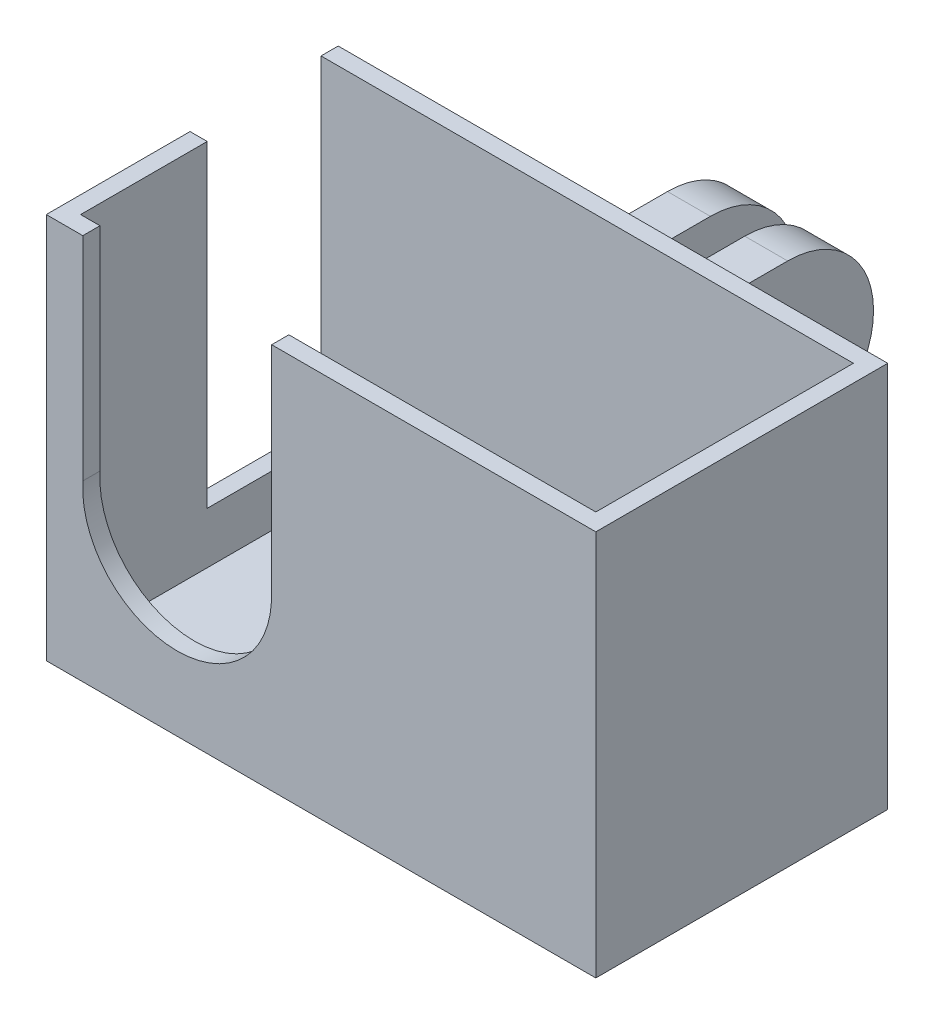
ISO-10303-21;
HEADER;
FILE_DESCRIPTION(('STEP AP214'),'2;1');
FILE_NAME('part.step','',(''),(''),'','','');
FILE_SCHEMA(('AUTOMOTIVE_DESIGN { 1 0 10303 214 1 1 1 1 }'));
ENDSEC;
DATA;
#1=APPLICATION_CONTEXT('core data for automotive mechanical design processes');
#2=APPLICATION_PROTOCOL_DEFINITION('international standard','automotive_design',2000,#1);
#3=PRODUCT_CONTEXT('',#1,'mechanical');
#4=PRODUCT('Part','Part','',(#3));
#5=PRODUCT_RELATED_PRODUCT_CATEGORY('part','',(#4));
#6=PRODUCT_DEFINITION_FORMATION('','',#4);
#7=PRODUCT_DEFINITION_CONTEXT('part definition',#1,'design');
#8=PRODUCT_DEFINITION('design','',#6,#7);
#9=PRODUCT_DEFINITION_SHAPE('','',#8);
#10=(LENGTH_UNIT() NAMED_UNIT(*) SI_UNIT(.MILLI.,.METRE.));
#11=(NAMED_UNIT(*) PLANE_ANGLE_UNIT() SI_UNIT($,.RADIAN.));
#12=(NAMED_UNIT(*) SI_UNIT($,.STERADIAN.) SOLID_ANGLE_UNIT());
#13=UNCERTAINTY_MEASURE_WITH_UNIT(LENGTH_MEASURE(1.E-05),#10,'distance_accuracy_value','');
#14=(GEOMETRIC_REPRESENTATION_CONTEXT(3) GLOBAL_UNCERTAINTY_ASSIGNED_CONTEXT((#13)) GLOBAL_UNIT_ASSIGNED_CONTEXT((#10,
#11,#12)) REPRESENTATION_CONTEXT('',''));
#15=CARTESIAN_POINT('',(0.,0.,0.));
#16=DIRECTION('',(0.,0.,1.));
#17=DIRECTION('',(1.,0.,0.));
#18=AXIS2_PLACEMENT_3D('',#15,#16,#17);
#19=CARTESIAN_POINT('',(-30.346218487395,18.5050420168067,34.));
#20=DIRECTION('',(0.,-1.,0.));
#21=DIRECTION('',(0.,0.,-1.));
#22=AXIS2_PLACEMENT_3D('',#19,#20,#21);
#23=PLANE('',#22);
#24=DIRECTION('',(-1.,0.,0.));
#25=VECTOR('',#24,1.);
#26=CARTESIAN_POINT('',(-30.346218487395,18.5050420168067,34.));
#27=LINE('',#26,#25);
#28=CARTESIAN_POINT('',(-26.0927681715252,18.5050420168067,34.));
#29=VERTEX_POINT('',#28);
#30=CARTESIAN_POINT('',(-30.346218487395,18.5050420168067,34.));
#31=VERTEX_POINT('',#30);
#32=EDGE_CURVE('E412',#29,#31,#27,.T.);
#33=ORIENTED_EDGE('',*,*,#32,.F.);
#34=DIRECTION('',(0.,0.,1.));
#35=VECTOR('',#34,1.);
#36=CARTESIAN_POINT('',(-26.0927681715252,18.5050420168067,-20.0587727318528));
#37=LINE('',#36,#35);
#38=CARTESIAN_POINT('',(-26.0927681715252,18.5050420168067,32.));
#39=VERTEX_POINT('',#38);
#40=EDGE_CURVE('E222',#39,#29,#37,.T.);
#41=ORIENTED_EDGE('',*,*,#40,.F.);
#42=DIRECTION('',(1.,0.,0.));
#43=VECTOR('',#42,1.);
#44=CARTESIAN_POINT('',(-28.346218487395,18.5050420168067,32.));
#45=LINE('',#44,#43);
#46=CARTESIAN_POINT('',(-28.346218487395,18.5050420168067,32.));
#47=VERTEX_POINT('',#46);
#48=EDGE_CURVE('E365',#47,#39,#45,.T.);
#49=ORIENTED_EDGE('',*,*,#48,.F.);
#50=DIRECTION('',(0.,0.,1.));
#51=VECTOR('',#50,1.);
#52=CARTESIAN_POINT('',(-28.346218487395,18.5050420168067,2.));
#53=LINE('',#52,#51);
#54=CARTESIAN_POINT('',(-28.346218487395,18.5050420168067,17.2555006177255));
#55=VERTEX_POINT('',#54);
#56=EDGE_CURVE('E356',#55,#47,#53,.T.);
#57=ORIENTED_EDGE('',*,*,#56,.F.);
#58=DIRECTION('',(-1.,0.,0.));
#59=VECTOR('',#58,1.);
#60=CARTESIAN_POINT('',(11.6754044069533,18.5050420168067,17.2555006177255));
#61=LINE('',#60,#59);
#62=CARTESIAN_POINT('',(-30.346218487395,18.5050420168067,17.2555006177255));
#63=VERTEX_POINT('',#62);
#64=EDGE_CURVE('E261',#55,#63,#61,.T.);
#65=ORIENTED_EDGE('',*,*,#64,.T.);
#66=DIRECTION('',(0.,0.,-1.));
#67=VECTOR('',#66,1.);
#68=CARTESIAN_POINT('',(-30.346218487395,18.5050420168067,34.));
#69=LINE('',#68,#67);
#70=EDGE_CURVE('E430',#31,#63,#69,.T.);
#71=ORIENTED_EDGE('',*,*,#70,.F.);
#72=EDGE_LOOP('',(#33,#41,#49,#57,#65,#71));
#73=FACE_BOUND('',#72,.T.);
#74=ADVANCED_FACE('F41',(#73),#23,.F.);
#75=CARTESIAN_POINT('',(0.,0.,0.));
#76=DIRECTION('',(0.,0.,1.));
#77=DIRECTION('',(1.,0.,0.));
#78=AXIS2_PLACEMENT_3D('',#75,#76,#77);
#79=PLANE('',#78);
#80=DIRECTION('',(0.,-1.,0.));
#81=VECTOR('',#80,1.);
#82=CARTESIAN_POINT('',(-30.346218487395,18.5050420168067,0.));
#83=LINE('',#82,#81);
#84=CARTESIAN_POINT('',(-30.346218487395,18.5050420168067,0.));
#85=VERTEX_POINT('',#84);
#86=CARTESIAN_POINT('',(-30.346218487395,-26.4949579831933,0.));
#87=VERTEX_POINT('',#86);
#88=EDGE_CURVE('E398',#85,#87,#83,.T.);
#89=ORIENTED_EDGE('',*,*,#88,.F.);
#90=DIRECTION('',(-1.,0.,0.));
#91=VECTOR('',#90,1.);
#92=CARTESIAN_POINT('',(-30.346218487395,18.5050420168067,0.));
#93=LINE('',#92,#91);
#94=CARTESIAN_POINT('',(33.653781512605,18.5050420168067,0.));
#95=VERTEX_POINT('',#94);
#96=EDGE_CURVE('E406',#95,#85,#93,.T.);
#97=ORIENTED_EDGE('',*,*,#96,.F.);
#98=DIRECTION('',(0.,1.,0.));
#99=VECTOR('',#98,1.);
#100=CARTESIAN_POINT('',(33.653781512605,18.5050420168067,0.));
#101=LINE('',#100,#99);
#102=CARTESIAN_POINT('',(33.653781512605,-26.4949579831933,0.));
#103=VERTEX_POINT('',#102);
#104=EDGE_CURVE('E424',#103,#95,#101,.T.);
#105=ORIENTED_EDGE('',*,*,#104,.F.);
#106=DIRECTION('',(1.,0.,0.));
#107=VECTOR('',#106,1.);
#108=CARTESIAN_POINT('',(-30.346218487395,-26.4949579831933,0.));
#109=LINE('',#108,#107);
#110=EDGE_CURVE('E421',#87,#103,#109,.T.);
#111=ORIENTED_EDGE('',*,*,#110,.F.);
#112=EDGE_LOOP('',(#89,#97,#105,#111));
#113=FACE_BOUND('',#112,.T.);
#114=DIRECTION('',(-1.,0.,0.));
#115=VECTOR('',#114,1.);
#116=CARTESIAN_POINT('',(7.,7.99964293282017,0.));
#117=LINE('',#116,#115);
#118=CARTESIAN_POINT('',(7.,7.99964293282017,0.));
#119=VERTEX_POINT('',#118);
#120=CARTESIAN_POINT('',(2.,7.99964293282017,0.));
#121=VERTEX_POINT('',#120);
#122=EDGE_CURVE('E328',#119,#121,#117,.T.);
#123=ORIENTED_EDGE('',*,*,#122,.T.);
#124=DIRECTION('',(0.,-1.,0.));
#125=VECTOR('',#124,1.);
#126=CARTESIAN_POINT('',(2.,7.99964293282017,0.));
#127=LINE('',#126,#125);
#128=CARTESIAN_POINT('',(2.,-12.0003570671798,0.));
#129=VERTEX_POINT('',#128);
#130=EDGE_CURVE('E304',#121,#129,#127,.T.);
#131=ORIENTED_EDGE('',*,*,#130,.T.);
#132=DIRECTION('',(-1.,0.,0.));
#133=VECTOR('',#132,1.);
#134=CARTESIAN_POINT('',(7.,-12.0003570671798,0.));
#135=LINE('',#134,#133);
#136=CARTESIAN_POINT('',(7.,-12.0003570671798,0.));
#137=VERTEX_POINT('',#136);
#138=EDGE_CURVE('E352',#137,#129,#135,.T.);
#139=ORIENTED_EDGE('',*,*,#138,.F.);
#140=DIRECTION('',(0.,-1.,0.));
#141=VECTOR('',#140,1.);
#142=CARTESIAN_POINT('',(7.,7.99964293282017,0.));
#143=LINE('',#142,#141);
#144=EDGE_CURVE('E314',#119,#137,#143,.T.);
#145=ORIENTED_EDGE('',*,*,#144,.F.);
#146=EDGE_LOOP('',(#123,#131,#139,#145));
#147=FACE_BOUND('',#146,.T.);
#148=DIRECTION('',(0.,-1.,0.));
#149=VECTOR('',#148,1.);
#150=CARTESIAN_POINT('',(-7.,-12.0003570671798,0.));
#151=LINE('',#150,#149);
#152=CARTESIAN_POINT('',(-7.,7.99964293282017,0.));
#153=VERTEX_POINT('',#152);
#154=CARTESIAN_POINT('',(-7.,-12.0003570671798,0.));
#155=VERTEX_POINT('',#154);
#156=EDGE_CURVE('E282',#153,#155,#151,.T.);
#157=ORIENTED_EDGE('',*,*,#156,.T.);
#158=DIRECTION('',(1.,0.,0.));
#159=VECTOR('',#158,1.);
#160=CARTESIAN_POINT('',(-7.,-12.0003570671798,0.));
#161=LINE('',#160,#159);
#162=CARTESIAN_POINT('',(-2.,-12.0003570671798,0.));
#163=VERTEX_POINT('',#162);
#164=EDGE_CURVE('E300',#155,#163,#161,.T.);
#165=ORIENTED_EDGE('',*,*,#164,.T.);
#166=DIRECTION('',(0.,-1.,0.));
#167=VECTOR('',#166,1.);
#168=CARTESIAN_POINT('',(-2.,-12.0003570671798,0.));
#169=LINE('',#168,#167);
#170=CARTESIAN_POINT('',(-2.,7.99964293282017,0.));
#171=VERTEX_POINT('',#170);
#172=EDGE_CURVE('E275',#171,#163,#169,.T.);
#173=ORIENTED_EDGE('',*,*,#172,.F.);
#174=DIRECTION('',(1.,0.,0.));
#175=VECTOR('',#174,1.);
#176=CARTESIAN_POINT('',(-7.,7.99964293282017,0.));
#177=LINE('',#176,#175);
#178=EDGE_CURVE('E305',#153,#171,#177,.T.);
#179=ORIENTED_EDGE('',*,*,#178,.F.);
#180=EDGE_LOOP('',(#157,#165,#173,#179));
#181=FACE_BOUND('',#180,.T.);
#182=ADVANCED_FACE('F502',(#113,#147,#181),#79,.F.);
#183=CARTESIAN_POINT('',(-30.346218487395,18.5050420168067,34.));
#184=DIRECTION('',(1.,0.,0.));
#185=DIRECTION('',(0.,1.,0.));
#186=AXIS2_PLACEMENT_3D('',#183,#184,#185);
#187=PLANE('',#186);
#188=DIRECTION('',(0.,0.,1.));
#189=VECTOR('',#188,1.);
#190=CARTESIAN_POINT('',(-30.346218487395,-18.4949579831933,2.));
#191=LINE('',#190,#189);
#192=CARTESIAN_POINT('',(-30.346218487395,-18.4949579831933,2.));
#193=VERTEX_POINT('',#192);
#194=CARTESIAN_POINT('',(-30.346218487395,-18.4949579831933,17.2555006177255));
#195=VERTEX_POINT('',#194);
#196=EDGE_CURVE('E235',#193,#195,#191,.T.);
#197=ORIENTED_EDGE('',*,*,#196,.F.);
#198=DIRECTION('',(0.,-1.,0.));
#199=VECTOR('',#198,1.);
#200=CARTESIAN_POINT('',(-30.346218487395,-18.4949579831933,2.));
#201=LINE('',#200,#199);
#202=CARTESIAN_POINT('',(-30.346218487395,18.5050420168067,2.));
#203=VERTEX_POINT('',#202);
#204=EDGE_CURVE('E254',#203,#193,#201,.T.);
#205=ORIENTED_EDGE('',*,*,#204,.F.);
#206=EDGE_CURVE('E417',#203,#85,#69,.T.);
#207=ORIENTED_EDGE('',*,*,#206,.T.);
#208=ORIENTED_EDGE('',*,*,#88,.T.);
#209=DIRECTION('',(0.,0.,-1.));
#210=VECTOR('',#209,1.);
#211=CARTESIAN_POINT('',(-30.346218487395,-26.4949579831933,34.));
#212=LINE('',#211,#210);
#213=CARTESIAN_POINT('',(-30.346218487395,-26.4949579831933,34.));
#214=VERTEX_POINT('',#213);
#215=EDGE_CURVE('E442',#214,#87,#212,.T.);
#216=ORIENTED_EDGE('',*,*,#215,.F.);
#217=DIRECTION('',(0.,-1.,0.));
#218=VECTOR('',#217,1.);
#219=CARTESIAN_POINT('',(-30.346218487395,18.5050420168067,34.));
#220=LINE('',#219,#218);
#221=EDGE_CURVE('E401',#31,#214,#220,.T.);
#222=ORIENTED_EDGE('',*,*,#221,.F.);
#223=ORIENTED_EDGE('',*,*,#70,.T.);
#224=DIRECTION('',(0.,1.,0.));
#225=VECTOR('',#224,1.);
#226=CARTESIAN_POINT('',(-30.346218487395,-18.4949579831933,17.2555006177255));
#227=LINE('',#226,#225);
#228=EDGE_CURVE('E251',#195,#63,#227,.T.);
#229=ORIENTED_EDGE('',*,*,#228,.F.);
#230=EDGE_LOOP('',(#197,#205,#207,#208,#216,#222,#223,#229));
#231=FACE_BOUND('',#230,.T.);
#232=ADVANCED_FACE('F43',(#231),#187,.F.);
#233=CARTESIAN_POINT('',(-30.346218487395,-26.4949579831933,34.));
#234=DIRECTION('',(0.,1.,0.));
#235=DIRECTION('',(0.,0.,1.));
#236=AXIS2_PLACEMENT_3D('',#233,#234,#235);
#237=PLANE('',#236);
#238=ORIENTED_EDGE('',*,*,#110,.T.);
#239=DIRECTION('',(0.,0.,-1.));
#240=VECTOR('',#239,1.);
#241=CARTESIAN_POINT('',(33.653781512605,-26.4949579831933,34.));
#242=LINE('',#241,#240);
#243=CARTESIAN_POINT('',(33.653781512605,-26.4949579831933,34.));
#244=VERTEX_POINT('',#243);
#245=EDGE_CURVE('E438',#244,#103,#242,.T.);
#246=ORIENTED_EDGE('',*,*,#245,.F.);
#247=DIRECTION('',(1.,0.,0.));
#248=VECTOR('',#247,1.);
#249=CARTESIAN_POINT('',(-30.346218487395,-26.4949579831933,34.));
#250=LINE('',#249,#248);
#251=EDGE_CURVE('E405',#214,#244,#250,.T.);
#252=ORIENTED_EDGE('',*,*,#251,.F.);
#253=ORIENTED_EDGE('',*,*,#215,.T.);
#254=EDGE_LOOP('',(#238,#246,#252,#253));
#255=FACE_BOUND('',#254,.T.);
#256=ADVANCED_FACE('F517',(#255),#237,.F.);
#257=CARTESIAN_POINT('',(33.653781512605,18.5050420168067,34.));
#258=DIRECTION('',(-1.,0.,0.));
#259=DIRECTION('',(0.,0.,1.));
#260=AXIS2_PLACEMENT_3D('',#257,#258,#259);
#261=PLANE('',#260);
#262=ORIENTED_EDGE('',*,*,#104,.T.);
#263=DIRECTION('',(0.,0.,-1.));
#264=VECTOR('',#263,1.);
#265=CARTESIAN_POINT('',(33.653781512605,18.5050420168067,34.));
#266=LINE('',#265,#264);
#267=CARTESIAN_POINT('',(33.653781512605,18.5050420168067,34.));
#268=VERTEX_POINT('',#267);
#269=EDGE_CURVE('E434',#268,#95,#266,.T.);
#270=ORIENTED_EDGE('',*,*,#269,.F.);
#271=DIRECTION('',(0.,1.,0.));
#272=VECTOR('',#271,1.);
#273=CARTESIAN_POINT('',(33.653781512605,18.5050420168067,34.));
#274=LINE('',#273,#272);
#275=EDGE_CURVE('E409',#244,#268,#274,.T.);
#276=ORIENTED_EDGE('',*,*,#275,.F.);
#277=ORIENTED_EDGE('',*,*,#245,.T.);
#278=EDGE_LOOP('',(#262,#270,#276,#277));
#279=FACE_BOUND('',#278,.T.);
#280=ADVANCED_FACE('F511',(#279),#261,.F.);
#281=CARTESIAN_POINT('',(-4.09276817152525,18.5050420168067,32.));
#282=VERTEX_POINT('',#281);
#283=CARTESIAN_POINT('',(31.653781512605,18.5050420168067,32.));
#284=VERTEX_POINT('',#283);
#285=EDGE_CURVE('E369',#282,#284,#45,.T.);
#286=ORIENTED_EDGE('',*,*,#285,.F.);
#287=DIRECTION('',(0.,0.,1.));
#288=VECTOR('',#287,1.);
#289=CARTESIAN_POINT('',(-4.09276817152525,18.5050420168067,-20.0587727318528));
#290=LINE('',#289,#288);
#291=CARTESIAN_POINT('',(-4.09276817152525,18.5050420168067,34.));
#292=VERTEX_POINT('',#291);
#293=EDGE_CURVE('E236',#282,#292,#290,.T.);
#294=ORIENTED_EDGE('',*,*,#293,.T.);
#295=EDGE_CURVE('E413',#268,#292,#27,.T.);
#296=ORIENTED_EDGE('',*,*,#295,.F.);
#297=ORIENTED_EDGE('',*,*,#269,.T.);
#298=ORIENTED_EDGE('',*,*,#96,.T.);
#299=ORIENTED_EDGE('',*,*,#206,.F.);
#300=DIRECTION('',(-1.,0.,0.));
#301=VECTOR('',#300,1.);
#302=CARTESIAN_POINT('',(-28.346218487395,18.5050420168067,2.));
#303=LINE('',#302,#301);
#304=CARTESIAN_POINT('',(31.653781512605,18.5050420168067,2.));
#305=VERTEX_POINT('',#304);
#306=EDGE_CURVE('E357',#305,#203,#303,.T.);
#307=ORIENTED_EDGE('',*,*,#306,.F.);
#308=DIRECTION('',(0.,0.,-1.));
#309=VECTOR('',#308,1.);
#310=CARTESIAN_POINT('',(31.653781512605,18.5050420168067,2.));
#311=LINE('',#310,#309);
#312=EDGE_CURVE('E361',#284,#305,#311,.T.);
#313=ORIENTED_EDGE('',*,*,#312,.F.);
#314=EDGE_LOOP('',(#286,#294,#296,#297,#298,#299,#307,#313));
#315=FACE_BOUND('',#314,.T.);
#316=ADVANCED_FACE('F471',(#315),#23,.F.);
#317=CARTESIAN_POINT('',(0.,0.,34.));
#318=DIRECTION('',(0.,0.,1.));
#319=DIRECTION('',(1.,0.,0.));
#320=AXIS2_PLACEMENT_3D('',#317,#318,#319);
#321=PLANE('',#320);
#322=CARTESIAN_POINT('',(-15.1121480528817,-6.88981749201526,34.));
#323=DIRECTION('',(0.,0.,1.));
#324=DIRECTION('',(1.,0.,0.));
#325=AXIS2_PLACEMENT_3D('',#322,#323,#324);
#326=CIRCLE('',#325,11.);
#327=CARTESIAN_POINT('',(-26.0927681715252,-6.23714467195829,34.));
#328=VERTEX_POINT('',#327);
#329=CARTESIAN_POINT('',(-4.12880589368733,-7.49495798319327,34.));
#330=VERTEX_POINT('',#329);
#331=EDGE_CURVE('E57',#328,#330,#326,.T.);
#332=ORIENTED_EDGE('',*,*,#331,.F.);
#333=DIRECTION('',(0.,-1.,0.));
#334=VECTOR('',#333,1.);
#335=CARTESIAN_POINT('',(-26.0927681715252,18.5050420168067,34.));
#336=LINE('',#335,#334);
#337=EDGE_CURVE('E209',#29,#328,#336,.T.);
#338=ORIENTED_EDGE('',*,*,#337,.F.);
#339=ORIENTED_EDGE('',*,*,#32,.T.);
#340=ORIENTED_EDGE('',*,*,#221,.T.);
#341=ORIENTED_EDGE('',*,*,#251,.T.);
#342=ORIENTED_EDGE('',*,*,#275,.T.);
#343=ORIENTED_EDGE('',*,*,#295,.T.);
#344=DIRECTION('',(0.,1.,0.));
#345=VECTOR('',#344,1.);
#346=CARTESIAN_POINT('',(-4.09276817152525,18.5050420168067,34.));
#347=LINE('',#346,#345);
#348=CARTESIAN_POINT('',(-4.09276817152524,-7.49495798319327,34.));
#349=VERTEX_POINT('',#348);
#350=EDGE_CURVE('E226',#349,#292,#347,.T.);
#351=ORIENTED_EDGE('',*,*,#350,.F.);
#352=DIRECTION('',(1.,0.,0.));
#353=VECTOR('',#352,1.);
#354=CARTESIAN_POINT('',(-26.0927681715252,-7.49495798319327,34.));
#355=LINE('',#354,#353);
#356=EDGE_CURVE('E217',#330,#349,#355,.T.);
#357=ORIENTED_EDGE('',*,*,#356,.F.);
#358=EDGE_LOOP('',(#332,#338,#339,#340,#341,#342,#343,#351,#357));
#359=FACE_BOUND('',#358,.T.);
#360=ADVANCED_FACE('F214',(#359),#321,.T.);
#361=CARTESIAN_POINT('',(-28.346218487395,-91.576997308187,2.));
#362=DIRECTION('',(0.,0.,-1.));
#363=DIRECTION('',(-1.,0.,0.));
#364=AXIS2_PLACEMENT_3D('',#361,#362,#363);
#365=PLANE('',#364);
#366=DIRECTION('',(0.,1.,0.));
#367=VECTOR('',#366,1.);
#368=CARTESIAN_POINT('',(31.653781512605,-91.576997308187,2.));
#369=LINE('',#368,#367);
#370=CARTESIAN_POINT('',(31.653781512605,-24.4949579831933,2.));
#371=VERTEX_POINT('',#370);
#372=EDGE_CURVE('E360',#371,#305,#369,.T.);
#373=ORIENTED_EDGE('',*,*,#372,.T.);
#374=ORIENTED_EDGE('',*,*,#306,.T.);
#375=ORIENTED_EDGE('',*,*,#204,.T.);
#376=DIRECTION('',(-1.,0.,0.));
#377=VECTOR('',#376,1.);
#378=CARTESIAN_POINT('',(11.6754044069533,-18.4949579831933,2.));
#379=LINE('',#378,#377);
#380=CARTESIAN_POINT('',(-28.346218487395,-18.4949579831933,2.));
#381=VERTEX_POINT('',#380);
#382=EDGE_CURVE('E247',#381,#193,#379,.T.);
#383=ORIENTED_EDGE('',*,*,#382,.F.);
#384=DIRECTION('',(0.,1.,0.));
#385=VECTOR('',#384,1.);
#386=CARTESIAN_POINT('',(-28.346218487395,-91.576997308187,2.));
#387=LINE('',#386,#385);
#388=CARTESIAN_POINT('',(-28.346218487395,-24.4949579831933,2.));
#389=VERTEX_POINT('',#388);
#390=EDGE_CURVE('E376',#389,#381,#387,.T.);
#391=ORIENTED_EDGE('',*,*,#390,.F.);
#392=DIRECTION('',(-1.,0.,0.));
#393=VECTOR('',#392,1.);
#394=CARTESIAN_POINT('',(-28.346218487395,-24.4949579831933,2.));
#395=LINE('',#394,#393);
#396=EDGE_CURVE('E372',#371,#389,#395,.T.);
#397=ORIENTED_EDGE('',*,*,#396,.F.);
#398=EDGE_LOOP('',(#373,#374,#375,#383,#391,#397));
#399=FACE_BOUND('',#398,.T.);
#400=ADVANCED_FACE('F475',(#399),#365,.F.);
#401=CARTESIAN_POINT('',(-28.346218487395,16.5050420168067,5.));
#402=DIRECTION('',(-1.,0.,0.));
#403=DIRECTION('',(0.,-1.,0.));
#404=AXIS2_PLACEMENT_3D('',#401,#402,#403);
#405=PLANE('',#404);
#406=ORIENTED_EDGE('',*,*,#390,.T.);
#407=DIRECTION('',(0.,0.,-1.));
#408=VECTOR('',#407,1.);
#409=CARTESIAN_POINT('',(-28.346218487395,-18.4949579831933,2.));
#410=LINE('',#409,#408);
#411=CARTESIAN_POINT('',(-28.346218487395,-18.4949579831933,17.2555006177255));
#412=VERTEX_POINT('',#411);
#413=EDGE_CURVE('E243',#412,#381,#410,.T.);
#414=ORIENTED_EDGE('',*,*,#413,.F.);
#415=DIRECTION('',(0.,-1.,0.));
#416=VECTOR('',#415,1.);
#417=CARTESIAN_POINT('',(-28.346218487395,-18.4949579831933,17.2555006177255));
#418=LINE('',#417,#416);
#419=EDGE_CURVE('E246',#55,#412,#418,.T.);
#420=ORIENTED_EDGE('',*,*,#419,.F.);
#421=ORIENTED_EDGE('',*,*,#56,.T.);
#422=DIRECTION('',(0.,-1.,0.));
#423=VECTOR('',#422,1.);
#424=CARTESIAN_POINT('',(-28.346218487395,16.5050420168067,32.));
#425=LINE('',#424,#423);
#426=CARTESIAN_POINT('',(-28.346218487395,-24.4949579831933,32.));
#427=VERTEX_POINT('',#426);
#428=EDGE_CURVE('E380',#47,#427,#425,.T.);
#429=ORIENTED_EDGE('',*,*,#428,.T.);
#430=DIRECTION('',(0.,0.,1.));
#431=VECTOR('',#430,1.);
#432=CARTESIAN_POINT('',(-28.346218487395,-24.4949579831933,5.));
#433=LINE('',#432,#431);
#434=EDGE_CURVE('E394',#389,#427,#433,.T.);
#435=ORIENTED_EDGE('',*,*,#434,.F.);
#436=EDGE_LOOP('',(#406,#414,#420,#421,#429,#435));
#437=FACE_BOUND('',#436,.T.);
#438=ADVANCED_FACE('F487',(#437),#405,.F.);
#439=CARTESIAN_POINT('',(31.653781512605,16.5050420168067,5.));
#440=DIRECTION('',(1.,0.,0.));
#441=DIRECTION('',(0.,1.,0.));
#442=AXIS2_PLACEMENT_3D('',#439,#440,#441);
#443=PLANE('',#442);
#444=DIRECTION('',(0.,1.,0.));
#445=VECTOR('',#444,1.);
#446=CARTESIAN_POINT('',(31.653781512605,16.5050420168067,32.));
#447=LINE('',#446,#445);
#448=CARTESIAN_POINT('',(31.653781512605,-24.4949579831933,32.));
#449=VERTEX_POINT('',#448);
#450=EDGE_CURVE('E390',#449,#284,#447,.T.);
#451=ORIENTED_EDGE('',*,*,#450,.T.);
#452=ORIENTED_EDGE('',*,*,#312,.T.);
#453=ORIENTED_EDGE('',*,*,#372,.F.);
#454=DIRECTION('',(0.,0.,1.));
#455=VECTOR('',#454,1.);
#456=CARTESIAN_POINT('',(31.653781512605,-24.4949579831933,5.));
#457=LINE('',#456,#455);
#458=EDGE_CURVE('E395',#371,#449,#457,.T.);
#459=ORIENTED_EDGE('',*,*,#458,.T.);
#460=EDGE_LOOP('',(#451,#452,#453,#459));
#461=FACE_BOUND('',#460,.T.);
#462=ADVANCED_FACE('F468',(#461),#443,.F.);
#463=CARTESIAN_POINT('',(-28.346218487395,-24.4949579831933,5.));
#464=DIRECTION('',(0.,-1.,0.));
#465=DIRECTION('',(0.,0.,-1.));
#466=AXIS2_PLACEMENT_3D('',#463,#464,#465);
#467=PLANE('',#466);
#468=DIRECTION('',(1.,0.,0.));
#469=VECTOR('',#468,1.);
#470=CARTESIAN_POINT('',(-28.346218487395,-24.4949579831933,32.));
#471=LINE('',#470,#469);
#472=EDGE_CURVE('E386',#427,#449,#471,.T.);
#473=ORIENTED_EDGE('',*,*,#472,.T.);
#474=ORIENTED_EDGE('',*,*,#458,.F.);
#475=ORIENTED_EDGE('',*,*,#396,.T.);
#476=ORIENTED_EDGE('',*,*,#434,.T.);
#477=EDGE_LOOP('',(#473,#474,#475,#476));
#478=FACE_BOUND('',#477,.T.);
#479=ADVANCED_FACE('F490',(#478),#467,.F.);
#480=CARTESIAN_POINT('',(0.,0.,32.));
#481=DIRECTION('',(0.,0.,1.));
#482=DIRECTION('',(1.,0.,0.));
#483=AXIS2_PLACEMENT_3D('',#480,#481,#482);
#484=PLANE('',#483);
#485=DIRECTION('',(0.,-1.,0.));
#486=VECTOR('',#485,1.);
#487=CARTESIAN_POINT('',(-26.0927681715252,0.,32.));
#488=LINE('',#487,#486);
#489=CARTESIAN_POINT('',(-26.0927681715252,-6.23714467195829,32.));
#490=VERTEX_POINT('',#489);
#491=EDGE_CURVE('E50',#39,#490,#488,.T.);
#492=ORIENTED_EDGE('',*,*,#491,.T.);
#493=CARTESIAN_POINT('',(-15.1121480528817,-6.88981749201526,32.));
#494=DIRECTION('',(0.,0.,1.));
#495=DIRECTION('',(1.,0.,0.));
#496=AXIS2_PLACEMENT_3D('',#493,#494,#495);
#497=CIRCLE('',#496,11.);
#498=CARTESIAN_POINT('',(-4.12880589368733,-7.49495798319327,32.));
#499=VERTEX_POINT('',#498);
#500=EDGE_CURVE('E204',#490,#499,#497,.T.);
#501=ORIENTED_EDGE('',*,*,#500,.T.);
#502=DIRECTION('',(1.,0.,0.));
#503=VECTOR('',#502,1.);
#504=CARTESIAN_POINT('',(0.,-7.49495798319327,32.));
#505=LINE('',#504,#503);
#506=CARTESIAN_POINT('',(-4.09276817152524,-7.49495798319327,32.));
#507=VERTEX_POINT('',#506);
#508=EDGE_CURVE('E64',#499,#507,#505,.T.);
#509=ORIENTED_EDGE('',*,*,#508,.T.);
#510=DIRECTION('',(0.,1.,0.));
#511=VECTOR('',#510,1.);
#512=CARTESIAN_POINT('',(-4.09276817152524,0.,32.));
#513=LINE('',#512,#511);
#514=EDGE_CURVE('E448',#507,#282,#513,.T.);
#515=ORIENTED_EDGE('',*,*,#514,.T.);
#516=ORIENTED_EDGE('',*,*,#285,.T.);
#517=ORIENTED_EDGE('',*,*,#450,.F.);
#518=ORIENTED_EDGE('',*,*,#472,.F.);
#519=ORIENTED_EDGE('',*,*,#428,.F.);
#520=ORIENTED_EDGE('',*,*,#48,.T.);
#521=EDGE_LOOP('',(#492,#501,#509,#515,#516,#517,#518,#519,#520));
#522=FACE_BOUND('',#521,.T.);
#523=ADVANCED_FACE('F451',(#522),#484,.F.);
#524=CARTESIAN_POINT('',(7.,-12.0003570671798,0.));
#525=DIRECTION('',(0.,1.,0.));
#526=DIRECTION('',(0.,0.,1.));
#527=AXIS2_PLACEMENT_3D('',#524,#525,#526);
#528=PLANE('',#527);
#529=DIRECTION('',(0.,0.,-1.));
#530=VECTOR('',#529,1.);
#531=CARTESIAN_POINT('',(2.,-12.0003570671798,0.));
#532=LINE('',#531,#530);
#533=CARTESIAN_POINT('',(2.,-12.0003570671798,-15.));
#534=VERTEX_POINT('',#533);
#535=EDGE_CURVE('E332',#129,#534,#532,.T.);
#536=ORIENTED_EDGE('',*,*,#535,.T.);
#537=DIRECTION('',(-1.,0.,0.));
#538=VECTOR('',#537,1.);
#539=CARTESIAN_POINT('',(7.,-12.0003570671798,-15.));
#540=LINE('',#539,#538);
#541=CARTESIAN_POINT('',(7.,-12.0003570671798,-15.));
#542=VERTEX_POINT('',#541);
#543=EDGE_CURVE('E348',#542,#534,#540,.T.);
#544=ORIENTED_EDGE('',*,*,#543,.F.);
#545=DIRECTION('',(0.,0.,-1.));
#546=VECTOR('',#545,1.);
#547=CARTESIAN_POINT('',(7.,-12.0003570671798,0.));
#548=LINE('',#547,#546);
#549=EDGE_CURVE('E318',#137,#542,#548,.T.);
#550=ORIENTED_EDGE('',*,*,#549,.F.);
#551=ORIENTED_EDGE('',*,*,#138,.T.);
#552=EDGE_LOOP('',(#536,#544,#550,#551));
#553=FACE_BOUND('',#552,.T.);
#554=ADVANCED_FACE('F497',(#553),#528,.F.);
#555=CARTESIAN_POINT('',(7.,-2.00035706717983,-15.));
#556=DIRECTION('',(-1.,0.,0.));
#557=DIRECTION('',(0.,0.,1.));
#558=AXIS2_PLACEMENT_3D('',#555,#556,#557);
#559=CYLINDRICAL_SURFACE('',#558,10.);
#560=CARTESIAN_POINT('',(2.,-2.00035706717983,-15.));
#561=DIRECTION('',(1.,0.,0.));
#562=DIRECTION('',(0.,0.,1.));
#563=AXIS2_PLACEMENT_3D('',#560,#561,#562);
#564=CIRCLE('',#563,10.);
#565=CARTESIAN_POINT('',(2.,7.99964293282017,-15.));
#566=VERTEX_POINT('',#565);
#567=EDGE_CURVE('E335',#534,#566,#564,.T.);
#568=ORIENTED_EDGE('',*,*,#567,.T.);
#569=DIRECTION('',(-1.,0.,0.));
#570=VECTOR('',#569,1.);
#571=CARTESIAN_POINT('',(7.,7.99964293282017,-15.));
#572=LINE('',#571,#570);
#573=CARTESIAN_POINT('',(7.,7.99964293282017,-15.));
#574=VERTEX_POINT('',#573);
#575=EDGE_CURVE('E344',#574,#566,#572,.T.);
#576=ORIENTED_EDGE('',*,*,#575,.F.);
#577=CARTESIAN_POINT('',(7.,-2.00035706717983,-15.));
#578=DIRECTION('',(1.,0.,0.));
#579=DIRECTION('',(0.,0.,1.));
#580=AXIS2_PLACEMENT_3D('',#577,#578,#579);
#581=CIRCLE('',#580,10.);
#582=EDGE_CURVE('E322',#542,#574,#581,.T.);
#583=ORIENTED_EDGE('',*,*,#582,.F.);
#584=ORIENTED_EDGE('',*,*,#543,.T.);
#585=EDGE_LOOP('',(#568,#576,#583,#584));
#586=FACE_BOUND('',#585,.T.);
#587=ADVANCED_FACE('F584',(#586),#559,.T.);
#588=CARTESIAN_POINT('',(7.,7.99964293282017,0.));
#589=DIRECTION('',(0.,-1.,0.));
#590=DIRECTION('',(0.,0.,-1.));
#591=AXIS2_PLACEMENT_3D('',#588,#589,#590);
#592=PLANE('',#591);
#593=DIRECTION('',(0.,0.,1.));
#594=VECTOR('',#593,1.);
#595=CARTESIAN_POINT('',(2.,7.99964293282017,0.));
#596=LINE('',#595,#594);
#597=EDGE_CURVE('E319',#566,#121,#596,.T.);
#598=ORIENTED_EDGE('',*,*,#597,.T.);
#599=ORIENTED_EDGE('',*,*,#122,.F.);
#600=DIRECTION('',(0.,0.,1.));
#601=VECTOR('',#600,1.);
#602=CARTESIAN_POINT('',(7.,7.99964293282017,0.));
#603=LINE('',#602,#601);
#604=EDGE_CURVE('E325',#574,#119,#603,.T.);
#605=ORIENTED_EDGE('',*,*,#604,.F.);
#606=ORIENTED_EDGE('',*,*,#575,.T.);
#607=EDGE_LOOP('',(#598,#599,#605,#606));
#608=FACE_BOUND('',#607,.T.);
#609=ADVANCED_FACE('F577',(#608),#592,.F.);
#610=CARTESIAN_POINT('',(7.,-2.00035706717983,-15.));
#611=DIRECTION('',(-1.,0.,0.));
#612=DIRECTION('',(0.,0.,1.));
#613=AXIS2_PLACEMENT_3D('',#610,#611,#612);
#614=PLANE('',#613);
#615=ORIENTED_EDGE('',*,*,#144,.T.);
#616=ORIENTED_EDGE('',*,*,#549,.T.);
#617=ORIENTED_EDGE('',*,*,#582,.T.);
#618=ORIENTED_EDGE('',*,*,#604,.T.);
#619=EDGE_LOOP('',(#615,#616,#617,#618));
#620=FACE_BOUND('',#619,.T.);
#621=ADVANCED_FACE('F574',(#620),#614,.F.);
#622=CARTESIAN_POINT('',(2.,-2.00035706717983,-15.));
#623=DIRECTION('',(-1.,0.,0.));
#624=DIRECTION('',(0.,0.,1.));
#625=AXIS2_PLACEMENT_3D('',#622,#623,#624);
#626=PLANE('',#625);
#627=ORIENTED_EDGE('',*,*,#130,.F.);
#628=ORIENTED_EDGE('',*,*,#597,.F.);
#629=ORIENTED_EDGE('',*,*,#567,.F.);
#630=ORIENTED_EDGE('',*,*,#535,.F.);
#631=EDGE_LOOP('',(#627,#628,#629,#630));
#632=FACE_BOUND('',#631,.T.);
#633=ADVANCED_FACE('F572',(#632),#626,.T.);
#634=CARTESIAN_POINT('',(-7.,-12.0003570671798,0.));
#635=DIRECTION('',(0.,-1.,0.));
#636=DIRECTION('',(0.,0.,-1.));
#637=AXIS2_PLACEMENT_3D('',#634,#635,#636);
#638=PLANE('',#637);
#639=DIRECTION('',(0.,0.,-1.));
#640=VECTOR('',#639,1.);
#641=CARTESIAN_POINT('',(-2.,-12.0003570671798,0.));
#642=LINE('',#641,#640);
#643=CARTESIAN_POINT('',(-2.,-12.0003570671798,-15.));
#644=VERTEX_POINT('',#643);
#645=EDGE_CURVE('E269',#163,#644,#642,.T.);
#646=ORIENTED_EDGE('',*,*,#645,.F.);
#647=ORIENTED_EDGE('',*,*,#164,.F.);
#648=DIRECTION('',(0.,0.,-1.));
#649=VECTOR('',#648,1.);
#650=CARTESIAN_POINT('',(-7.,-12.0003570671798,0.));
#651=LINE('',#650,#649);
#652=CARTESIAN_POINT('',(-7.,-12.0003570671798,-15.));
#653=VERTEX_POINT('',#652);
#654=EDGE_CURVE('E270',#155,#653,#651,.T.);
#655=ORIENTED_EDGE('',*,*,#654,.T.);
#656=DIRECTION('',(1.,0.,0.));
#657=VECTOR('',#656,1.);
#658=CARTESIAN_POINT('',(-7.,-12.0003570671798,-15.));
#659=LINE('',#658,#657);
#660=EDGE_CURVE('E286',#653,#644,#659,.T.);
#661=ORIENTED_EDGE('',*,*,#660,.T.);
#662=EDGE_LOOP('',(#646,#647,#655,#661));
#663=FACE_BOUND('',#662,.T.);
#664=ADVANCED_FACE('F565',(#663),#638,.T.);
#665=CARTESIAN_POINT('',(-7.,7.99964293282017,0.));
#666=DIRECTION('',(0.,1.,0.));
#667=DIRECTION('',(0.,0.,1.));
#668=AXIS2_PLACEMENT_3D('',#665,#666,#667);
#669=PLANE('',#668);
#670=DIRECTION('',(0.,0.,1.));
#671=VECTOR('',#670,1.);
#672=CARTESIAN_POINT('',(-2.,7.99964293282017,0.));
#673=LINE('',#672,#671);
#674=CARTESIAN_POINT('',(-2.,7.99964293282017,-15.));
#675=VERTEX_POINT('',#674);
#676=EDGE_CURVE('E294',#675,#171,#673,.T.);
#677=ORIENTED_EDGE('',*,*,#676,.F.);
#678=DIRECTION('',(1.,0.,0.));
#679=VECTOR('',#678,1.);
#680=CARTESIAN_POINT('',(-7.,7.99964293282017,-15.));
#681=LINE('',#680,#679);
#682=CARTESIAN_POINT('',(-7.,7.99964293282017,-15.));
#683=VERTEX_POINT('',#682);
#684=EDGE_CURVE('E309',#683,#675,#681,.T.);
#685=ORIENTED_EDGE('',*,*,#684,.F.);
#686=DIRECTION('',(0.,0.,1.));
#687=VECTOR('',#686,1.);
#688=CARTESIAN_POINT('',(-7.,7.99964293282017,0.));
#689=LINE('',#688,#687);
#690=EDGE_CURVE('E279',#683,#153,#689,.T.);
#691=ORIENTED_EDGE('',*,*,#690,.T.);
#692=ORIENTED_EDGE('',*,*,#178,.T.);
#693=EDGE_LOOP('',(#677,#685,#691,#692));
#694=FACE_BOUND('',#693,.T.);
#695=ADVANCED_FACE('F562',(#694),#669,.T.);
#696=CARTESIAN_POINT('',(-7.,-2.00035706717983,-15.));
#697=DIRECTION('',(1.,0.,0.));
#698=DIRECTION('',(0.,0.,-1.));
#699=AXIS2_PLACEMENT_3D('',#696,#697,#698);
#700=CYLINDRICAL_SURFACE('',#699,10.);
#701=CARTESIAN_POINT('',(-2.,-2.00035706717983,-15.));
#702=DIRECTION('',(1.,0.,0.));
#703=DIRECTION('',(0.,0.,-1.));
#704=AXIS2_PLACEMENT_3D('',#701,#702,#703);
#705=CIRCLE('',#704,10.);
#706=EDGE_CURVE('E290',#644,#675,#705,.T.);
#707=ORIENTED_EDGE('',*,*,#706,.F.);
#708=ORIENTED_EDGE('',*,*,#660,.F.);
#709=CARTESIAN_POINT('',(-7.,-2.00035706717983,-15.));
#710=DIRECTION('',(1.,0.,0.));
#711=DIRECTION('',(0.,0.,-1.));
#712=AXIS2_PLACEMENT_3D('',#709,#710,#711);
#713=CIRCLE('',#712,10.);
#714=EDGE_CURVE('E274',#653,#683,#713,.T.);
#715=ORIENTED_EDGE('',*,*,#714,.T.);
#716=ORIENTED_EDGE('',*,*,#684,.T.);
#717=EDGE_LOOP('',(#707,#708,#715,#716));
#718=FACE_BOUND('',#717,.T.);
#719=ADVANCED_FACE('F557',(#718),#700,.T.);
#720=CARTESIAN_POINT('',(-7.,-2.00035706717983,-15.));
#721=DIRECTION('',(1.,0.,0.));
#722=DIRECTION('',(0.,0.,-1.));
#723=AXIS2_PLACEMENT_3D('',#720,#721,#722);
#724=PLANE('',#723);
#725=ORIENTED_EDGE('',*,*,#654,.F.);
#726=ORIENTED_EDGE('',*,*,#156,.F.);
#727=ORIENTED_EDGE('',*,*,#690,.F.);
#728=ORIENTED_EDGE('',*,*,#714,.F.);
#729=EDGE_LOOP('',(#725,#726,#727,#728));
#730=FACE_BOUND('',#729,.T.);
#731=ADVANCED_FACE('F554',(#730),#724,.F.);
#732=CARTESIAN_POINT('',(-2.,-2.00035706717983,-15.));
#733=DIRECTION('',(1.,0.,0.));
#734=DIRECTION('',(0.,0.,-1.));
#735=AXIS2_PLACEMENT_3D('',#732,#733,#734);
#736=PLANE('',#735);
#737=ORIENTED_EDGE('',*,*,#645,.T.);
#738=ORIENTED_EDGE('',*,*,#706,.T.);
#739=ORIENTED_EDGE('',*,*,#676,.T.);
#740=ORIENTED_EDGE('',*,*,#172,.T.);
#741=EDGE_LOOP('',(#737,#738,#739,#740));
#742=FACE_BOUND('',#741,.T.);
#743=ADVANCED_FACE('F553',(#742),#736,.T.);
#744=CARTESIAN_POINT('',(11.6754044069533,-18.4949579831933,2.));
#745=DIRECTION('',(0.,-1.,0.));
#746=DIRECTION('',(0.,0.,-1.));
#747=AXIS2_PLACEMENT_3D('',#744,#745,#746);
#748=PLANE('',#747);
#749=ORIENTED_EDGE('',*,*,#413,.T.);
#750=ORIENTED_EDGE('',*,*,#382,.T.);
#751=ORIENTED_EDGE('',*,*,#196,.T.);
#752=DIRECTION('',(-1.,0.,0.));
#753=VECTOR('',#752,1.);
#754=CARTESIAN_POINT('',(11.6754044069533,-18.4949579831933,17.2555006177255));
#755=LINE('',#754,#753);
#756=EDGE_CURVE('E258',#412,#195,#755,.T.);
#757=ORIENTED_EDGE('',*,*,#756,.F.);
#758=EDGE_LOOP('',(#749,#750,#751,#757));
#759=FACE_BOUND('',#758,.T.);
#760=ADVANCED_FACE('F483',(#759),#748,.F.);
#761=CARTESIAN_POINT('',(11.6754044069533,-18.4949579831933,17.2555006177255));
#762=DIRECTION('',(0.,0.,1.));
#763=DIRECTION('',(1.,0.,0.));
#764=AXIS2_PLACEMENT_3D('',#761,#762,#763);
#765=PLANE('',#764);
#766=ORIENTED_EDGE('',*,*,#419,.T.);
#767=ORIENTED_EDGE('',*,*,#756,.T.);
#768=ORIENTED_EDGE('',*,*,#228,.T.);
#769=ORIENTED_EDGE('',*,*,#64,.F.);
#770=EDGE_LOOP('',(#766,#767,#768,#769));
#771=FACE_BOUND('',#770,.T.);
#772=ADVANCED_FACE('F547',(#771),#765,.F.);
#773=CARTESIAN_POINT('',(-26.0927681715252,18.5050420168067,-20.0587727318528));
#774=DIRECTION('',(-1.,0.,0.));
#775=DIRECTION('',(0.,0.,1.));
#776=AXIS2_PLACEMENT_3D('',#773,#774,#775);
#777=PLANE('',#776);
#778=ORIENTED_EDGE('',*,*,#337,.T.);
#779=DIRECTION('',(0.,0.,1.));
#780=VECTOR('',#779,1.);
#781=CARTESIAN_POINT('',(-26.0927681715252,-6.23714467195824,-17.1126983722081));
#782=LINE('',#781,#780);
#783=EDGE_CURVE('E202',#328,#490,#782,.F.);
#784=ORIENTED_EDGE('',*,*,#783,.T.);
#785=ORIENTED_EDGE('',*,*,#491,.F.);
#786=ORIENTED_EDGE('',*,*,#40,.T.);
#787=EDGE_LOOP('',(#778,#784,#785,#786));
#788=FACE_BOUND('',#787,.T.);
#789=ADVANCED_FACE('F220',(#788),#777,.F.);
#790=CARTESIAN_POINT('',(-4.09276817152525,18.5050420168067,-20.0587727318528));
#791=DIRECTION('',(1.,0.,0.));
#792=DIRECTION('',(0.,1.,0.));
#793=AXIS2_PLACEMENT_3D('',#790,#791,#792);
#794=PLANE('',#793);
#795=DIRECTION('',(0.,0.,1.));
#796=VECTOR('',#795,1.);
#797=CARTESIAN_POINT('',(-4.09276817152524,-7.49495798319327,-20.0587727318528));
#798=LINE('',#797,#796);
#799=EDGE_CURVE('E232',#507,#349,#798,.T.);
#800=ORIENTED_EDGE('',*,*,#799,.T.);
#801=ORIENTED_EDGE('',*,*,#350,.T.);
#802=ORIENTED_EDGE('',*,*,#293,.F.);
#803=ORIENTED_EDGE('',*,*,#514,.F.);
#804=EDGE_LOOP('',(#800,#801,#802,#803));
#805=FACE_BOUND('',#804,.T.);
#806=ADVANCED_FACE('F533',(#805),#794,.F.);
#807=CARTESIAN_POINT('',(-26.0927681715252,-7.49495798319327,-20.0587727318528));
#808=DIRECTION('',(0.,-1.,0.));
#809=DIRECTION('',(0.,0.,-1.));
#810=AXIS2_PLACEMENT_3D('',#807,#808,#809);
#811=PLANE('',#810);
#812=ORIENTED_EDGE('',*,*,#508,.F.);
#813=DIRECTION('',(0.,0.,1.));
#814=VECTOR('',#813,1.);
#815=CARTESIAN_POINT('',(-4.12880589368733,-7.49495798319327,-17.1126983722081));
#816=LINE('',#815,#814);
#817=EDGE_CURVE('E12',#499,#330,#816,.T.);
#818=ORIENTED_EDGE('',*,*,#817,.T.);
#819=ORIENTED_EDGE('',*,*,#356,.T.);
#820=ORIENTED_EDGE('',*,*,#799,.F.);
#821=EDGE_LOOP('',(#812,#818,#819,#820));
#822=FACE_BOUND('',#821,.T.);
#823=ADVANCED_FACE('F535',(#822),#811,.F.);
#824=CARTESIAN_POINT('',(-15.1121480528817,-6.88981749201526,-17.1126983722081));
#825=DIRECTION('',(0.,0.,1.));
#826=DIRECTION('',(1.,0.,0.));
#827=AXIS2_PLACEMENT_3D('',#824,#825,#826);
#828=CYLINDRICAL_SURFACE('',#827,11.);
#829=ORIENTED_EDGE('',*,*,#331,.T.);
#830=ORIENTED_EDGE('',*,*,#817,.F.);
#831=ORIENTED_EDGE('',*,*,#500,.F.);
#832=ORIENTED_EDGE('',*,*,#783,.F.);
#833=EDGE_LOOP('',(#829,#830,#831,#832));
#834=FACE_BOUND('',#833,.T.);
#835=ADVANCED_FACE('F203',(#834),#828,.F.);
#836=CLOSED_SHELL('',(#74,#182,#232,#256,#280,#316,#360,#400,#438,#462,#479,#523,#554,#587,#609,
#621,#633,#664,#695,#719,#731,#743,#760,#772,#789,#806,#823,#835));
#837=MANIFOLD_SOLID_BREP('B2',#836);
#838=ADVANCED_BREP_SHAPE_REPRESENTATION('',(#18,#837),#14);
#839=SHAPE_DEFINITION_REPRESENTATION(#9,#838);
ENDSEC;
END-ISO-10303-21;
